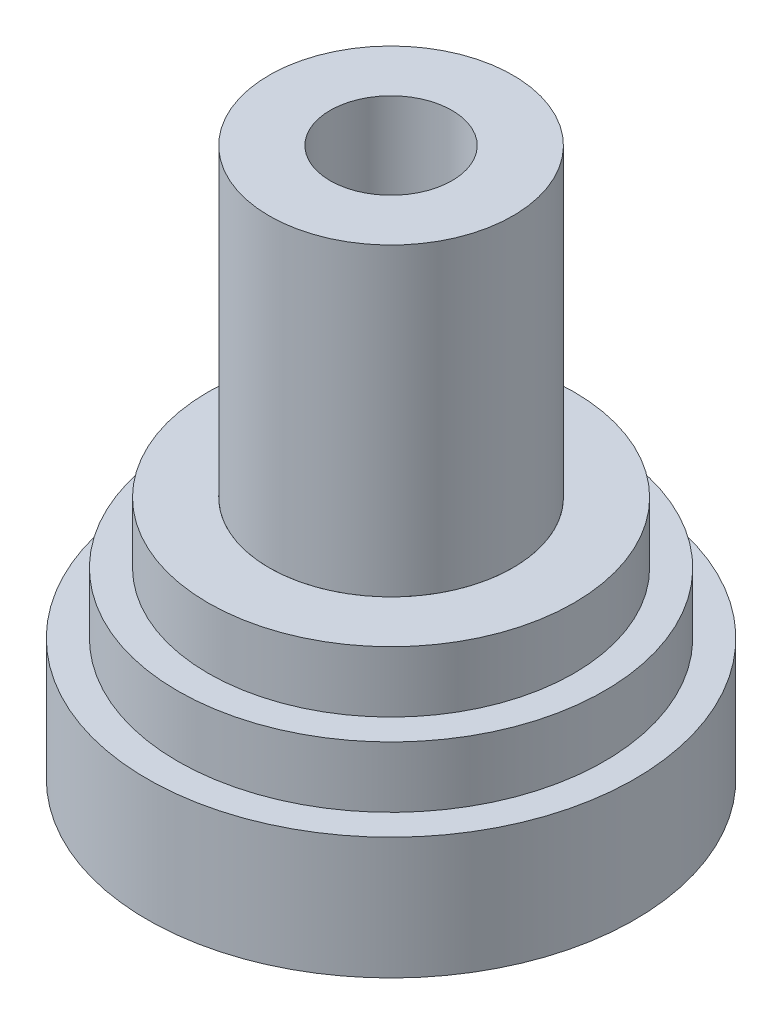
ISO-10303-21;
HEADER;
FILE_DESCRIPTION(('STEP AP214'),'2;1');
FILE_NAME('part.step','',(''),(''),'','','');
FILE_SCHEMA(('AUTOMOTIVE_DESIGN { 1 0 10303 214 1 1 1 1 }'));
ENDSEC;
DATA;
#1=APPLICATION_CONTEXT('core data for automotive mechanical design processes');
#2=APPLICATION_PROTOCOL_DEFINITION('international standard','automotive_design',2000,#1);
#3=PRODUCT_CONTEXT('',#1,'mechanical');
#4=PRODUCT('Part','Part','',(#3));
#5=PRODUCT_RELATED_PRODUCT_CATEGORY('part','',(#4));
#6=PRODUCT_DEFINITION_FORMATION('','',#4);
#7=PRODUCT_DEFINITION_CONTEXT('part definition',#1,'design');
#8=PRODUCT_DEFINITION('design','',#6,#7);
#9=PRODUCT_DEFINITION_SHAPE('','',#8);
#10=(LENGTH_UNIT() NAMED_UNIT(*) SI_UNIT(.MILLI.,.METRE.));
#11=(NAMED_UNIT(*) PLANE_ANGLE_UNIT() SI_UNIT($,.RADIAN.));
#12=(NAMED_UNIT(*) SI_UNIT($,.STERADIAN.) SOLID_ANGLE_UNIT());
#13=UNCERTAINTY_MEASURE_WITH_UNIT(LENGTH_MEASURE(1.E-05),#10,'distance_accuracy_value','');
#14=(GEOMETRIC_REPRESENTATION_CONTEXT(3) GLOBAL_UNCERTAINTY_ASSIGNED_CONTEXT((#13)) GLOBAL_UNIT_ASSIGNED_CONTEXT((#10,
#11,#12)) REPRESENTATION_CONTEXT('',''));
#15=CARTESIAN_POINT('',(0.,0.,0.));
#16=DIRECTION('',(0.,0.,1.));
#17=DIRECTION('',(1.,0.,0.));
#18=AXIS2_PLACEMENT_3D('',#15,#16,#17);
#19=CARTESIAN_POINT('',(0.,0.,-20.));
#20=DIRECTION('',(0.,1.,0.));
#21=DIRECTION('',(0.,0.,1.));
#22=AXIS2_PLACEMENT_3D('',#19,#20,#21);
#23=PLANE('',#22);
#24=CARTESIAN_POINT('',(0.,0.,0.));
#25=DIRECTION('',(0.,-1.,0.));
#26=DIRECTION('',(0.,0.,-1.));
#27=AXIS2_PLACEMENT_3D('',#24,#25,#26);
#28=CIRCLE('',#27,20.);
#29=CARTESIAN_POINT('',(0.,0.,-20.));
#30=VERTEX_POINT('',#29);
#31=EDGE_CURVE('E79',#30,#30,#28,.T.);
#32=ORIENTED_EDGE('',*,*,#31,.T.);
#33=EDGE_LOOP('',(#32));
#34=FACE_BOUND('',#33,.T.);
#35=CARTESIAN_POINT('',(0.,0.,0.));
#36=DIRECTION('',(0.,-1.,0.));
#37=DIRECTION('',(0.,0.,-1.));
#38=AXIS2_PLACEMENT_3D('',#35,#36,#37);
#39=CIRCLE('',#38,30.);
#40=CARTESIAN_POINT('',(0.,0.,-30.));
#41=VERTEX_POINT('',#40);
#42=EDGE_CURVE('E11',#41,#41,#39,.T.);
#43=ORIENTED_EDGE('',*,*,#42,.F.);
#44=EDGE_LOOP('',(#43));
#45=FACE_BOUND('',#44,.T.);
#46=ADVANCED_FACE('F45',(#34,#45),#23,.T.);
#47=CARTESIAN_POINT('',(0.,0.,0.));
#48=DIRECTION('',(0.,-1.,0.));
#49=DIRECTION('',(0.,0.,-1.));
#50=AXIS2_PLACEMENT_3D('',#47,#48,#49);
#51=CYLINDRICAL_SURFACE('',#50,30.);
#52=ORIENTED_EDGE('',*,*,#42,.T.);
#53=EDGE_LOOP('',(#52));
#54=FACE_BOUND('',#53,.T.);
#55=CARTESIAN_POINT('',(0.,-10.,0.));
#56=DIRECTION('',(0.,-1.,0.));
#57=DIRECTION('',(0.,0.,-1.));
#58=AXIS2_PLACEMENT_3D('',#55,#56,#57);
#59=CIRCLE('',#58,30.);
#60=CARTESIAN_POINT('',(0.,-10.,-30.));
#61=VERTEX_POINT('',#60);
#62=EDGE_CURVE('E51',#61,#61,#59,.T.);
#63=ORIENTED_EDGE('',*,*,#62,.F.);
#64=EDGE_LOOP('',(#63));
#65=FACE_BOUND('',#64,.T.);
#66=ADVANCED_FACE('F97',(#54,#65),#51,.T.);
#67=CARTESIAN_POINT('',(0.,-10.,-30.));
#68=DIRECTION('',(0.,1.,0.));
#69=DIRECTION('',(0.,0.,1.));
#70=AXIS2_PLACEMENT_3D('',#67,#68,#69);
#71=PLANE('',#70);
#72=ORIENTED_EDGE('',*,*,#62,.T.);
#73=EDGE_LOOP('',(#72));
#74=FACE_BOUND('',#73,.T.);
#75=CARTESIAN_POINT('',(0.,-10.,0.));
#76=DIRECTION('',(0.,-1.,0.));
#77=DIRECTION('',(0.,0.,-1.));
#78=AXIS2_PLACEMENT_3D('',#75,#76,#77);
#79=CIRCLE('',#78,35.);
#80=CARTESIAN_POINT('',(0.,-10.,-35.));
#81=VERTEX_POINT('',#80);
#82=EDGE_CURVE('E55',#81,#81,#79,.T.);
#83=ORIENTED_EDGE('',*,*,#82,.F.);
#84=EDGE_LOOP('',(#83));
#85=FACE_BOUND('',#84,.T.);
#86=ADVANCED_FACE('F101',(#74,#85),#71,.T.);
#87=CARTESIAN_POINT('',(0.,0.,0.));
#88=DIRECTION('',(0.,-1.,0.));
#89=DIRECTION('',(0.,0.,-1.));
#90=AXIS2_PLACEMENT_3D('',#87,#88,#89);
#91=CYLINDRICAL_SURFACE('',#90,35.);
#92=ORIENTED_EDGE('',*,*,#82,.T.);
#93=EDGE_LOOP('',(#92));
#94=FACE_BOUND('',#93,.T.);
#95=CARTESIAN_POINT('',(0.,-20.,0.));
#96=DIRECTION('',(0.,-1.,0.));
#97=DIRECTION('',(0.,0.,-1.));
#98=AXIS2_PLACEMENT_3D('',#95,#96,#97);
#99=CIRCLE('',#98,35.);
#100=CARTESIAN_POINT('',(0.,-20.,-35.));
#101=VERTEX_POINT('',#100);
#102=EDGE_CURVE('E59',#101,#101,#99,.T.);
#103=ORIENTED_EDGE('',*,*,#102,.F.);
#104=EDGE_LOOP('',(#103));
#105=FACE_BOUND('',#104,.T.);
#106=ADVANCED_FACE('F105',(#94,#105),#91,.T.);
#107=CARTESIAN_POINT('',(0.,-20.,-35.));
#108=DIRECTION('',(0.,1.,0.));
#109=DIRECTION('',(0.,0.,1.));
#110=AXIS2_PLACEMENT_3D('',#107,#108,#109);
#111=PLANE('',#110);
#112=ORIENTED_EDGE('',*,*,#102,.T.);
#113=EDGE_LOOP('',(#112));
#114=FACE_BOUND('',#113,.T.);
#115=CARTESIAN_POINT('',(0.,-20.,0.));
#116=DIRECTION('',(0.,-1.,0.));
#117=DIRECTION('',(0.,0.,-1.));
#118=AXIS2_PLACEMENT_3D('',#115,#116,#117);
#119=CIRCLE('',#118,40.);
#120=CARTESIAN_POINT('',(0.,-20.,-40.));
#121=VERTEX_POINT('',#120);
#122=EDGE_CURVE('E64',#121,#121,#119,.T.);
#123=ORIENTED_EDGE('',*,*,#122,.F.);
#124=EDGE_LOOP('',(#123));
#125=FACE_BOUND('',#124,.T.);
#126=ADVANCED_FACE('F111',(#114,#125),#111,.T.);
#127=CARTESIAN_POINT('',(0.,0.,0.));
#128=DIRECTION('',(0.,-1.,0.));
#129=DIRECTION('',(0.,0.,-1.));
#130=AXIS2_PLACEMENT_3D('',#127,#128,#129);
#131=CYLINDRICAL_SURFACE('',#130,40.);
#132=ORIENTED_EDGE('',*,*,#122,.T.);
#133=EDGE_LOOP('',(#132));
#134=FACE_BOUND('',#133,.T.);
#135=CARTESIAN_POINT('',(0.,-40.,0.));
#136=DIRECTION('',(0.,-1.,0.));
#137=DIRECTION('',(0.,0.,-1.));
#138=AXIS2_PLACEMENT_3D('',#135,#136,#137);
#139=CIRCLE('',#138,40.);
#140=CARTESIAN_POINT('',(0.,-40.,-40.));
#141=VERTEX_POINT('',#140);
#142=EDGE_CURVE('E67',#141,#141,#139,.T.);
#143=ORIENTED_EDGE('',*,*,#142,.F.);
#144=EDGE_LOOP('',(#143));
#145=FACE_BOUND('',#144,.T.);
#146=ADVANCED_FACE('F115',(#134,#145),#131,.T.);
#147=CARTESIAN_POINT('',(0.,-40.,-40.));
#148=DIRECTION('',(0.,-1.,0.));
#149=DIRECTION('',(0.,0.,-1.));
#150=AXIS2_PLACEMENT_3D('',#147,#148,#149);
#151=PLANE('',#150);
#152=ORIENTED_EDGE('',*,*,#142,.T.);
#153=EDGE_LOOP('',(#152));
#154=FACE_BOUND('',#153,.T.);
#155=CARTESIAN_POINT('',(0.,-40.,0.));
#156=DIRECTION('',(0.,-1.,0.));
#157=DIRECTION('',(0.,0.,-1.));
#158=AXIS2_PLACEMENT_3D('',#155,#156,#157);
#159=CIRCLE('',#158,30.);
#160=CARTESIAN_POINT('',(0.,-40.,-30.));
#161=VERTEX_POINT('',#160);
#162=EDGE_CURVE('E70',#161,#161,#159,.T.);
#163=ORIENTED_EDGE('',*,*,#162,.F.);
#164=EDGE_LOOP('',(#163));
#165=FACE_BOUND('',#164,.T.);
#166=ADVANCED_FACE('F119',(#154,#165),#151,.T.);
#167=CARTESIAN_POINT('',(0.,0.,0.));
#168=DIRECTION('',(0.,-1.,0.));
#169=DIRECTION('',(0.,0.,-1.));
#170=AXIS2_PLACEMENT_3D('',#167,#168,#169);
#171=CYLINDRICAL_SURFACE('',#170,30.);
#172=ORIENTED_EDGE('',*,*,#162,.T.);
#173=EDGE_LOOP('',(#172));
#174=FACE_BOUND('',#173,.T.);
#175=CARTESIAN_POINT('',(0.,-15.,0.));
#176=DIRECTION('',(0.,-1.,0.));
#177=DIRECTION('',(0.,0.,-1.));
#178=AXIS2_PLACEMENT_3D('',#175,#176,#177);
#179=CIRCLE('',#178,30.);
#180=CARTESIAN_POINT('',(0.,-15.,-30.));
#181=VERTEX_POINT('',#180);
#182=EDGE_CURVE('E73',#181,#181,#179,.T.);
#183=ORIENTED_EDGE('',*,*,#182,.F.);
#184=EDGE_LOOP('',(#183));
#185=FACE_BOUND('',#184,.T.);
#186=ADVANCED_FACE('F93',(#174,#185),#171,.F.);
#187=CARTESIAN_POINT('',(0.,-15.,-30.));
#188=DIRECTION('',(0.,-1.,0.));
#189=DIRECTION('',(0.,0.,-1.));
#190=AXIS2_PLACEMENT_3D('',#187,#188,#189);
#191=PLANE('',#190);
#192=ORIENTED_EDGE('',*,*,#182,.T.);
#193=EDGE_LOOP('',(#192));
#194=FACE_BOUND('',#193,.T.);
#195=CARTESIAN_POINT('',(0.,-15.,0.));
#196=DIRECTION('',(0.,-1.,0.));
#197=DIRECTION('',(0.,0.,-1.));
#198=AXIS2_PLACEMENT_3D('',#195,#196,#197);
#199=CIRCLE('',#198,20.);
#200=CARTESIAN_POINT('',(0.,-15.,-20.));
#201=VERTEX_POINT('',#200);
#202=EDGE_CURVE('E76',#201,#201,#199,.T.);
#203=ORIENTED_EDGE('',*,*,#202,.F.);
#204=EDGE_LOOP('',(#203));
#205=FACE_BOUND('',#204,.T.);
#206=ADVANCED_FACE('F87',(#194,#205),#191,.T.);
#207=CARTESIAN_POINT('',(0.,0.,0.));
#208=DIRECTION('',(0.,-1.,0.));
#209=DIRECTION('',(0.,0.,-1.));
#210=AXIS2_PLACEMENT_3D('',#207,#208,#209);
#211=CYLINDRICAL_SURFACE('',#210,20.);
#212=ORIENTED_EDGE('',*,*,#202,.T.);
#213=EDGE_LOOP('',(#212));
#214=FACE_BOUND('',#213,.T.);
#215=ORIENTED_EDGE('',*,*,#31,.F.);
#216=EDGE_LOOP('',(#215));
#217=FACE_BOUND('',#216,.T.);
#218=ADVANCED_FACE('F85',(#214,#217),#211,.F.);
#219=CLOSED_SHELL('',(#46,#66,#86,#106,#126,#146,#166,#186,#206,#218));
#220=MANIFOLD_SOLID_BREP('B2',#219);
#221=CARTESIAN_POINT('',(0.,50.,0.));
#222=DIRECTION('',(0.,-1.,0.));
#223=DIRECTION('',(0.,0.,-1.));
#224=AXIS2_PLACEMENT_3D('',#221,#222,#223);
#225=CYLINDRICAL_SURFACE('',#224,20.);
#226=CARTESIAN_POINT('',(0.,50.,0.));
#227=DIRECTION('',(0.,1.,0.));
#228=DIRECTION('',(0.,0.,1.));
#229=AXIS2_PLACEMENT_3D('',#226,#227,#228);
#230=CIRCLE('',#229,20.);
#231=CARTESIAN_POINT('',(0.,50.,20.));
#232=VERTEX_POINT('',#231);
#233=EDGE_CURVE('E44',#232,#232,#230,.T.);
#234=ORIENTED_EDGE('',*,*,#233,.F.);
#235=EDGE_LOOP('',(#234));
#236=FACE_BOUND('',#235,.T.);
#237=CARTESIAN_POINT('',(0.,0.,0.));
#238=DIRECTION('',(0.,1.,0.));
#239=DIRECTION('',(0.,0.,1.));
#240=AXIS2_PLACEMENT_3D('',#237,#238,#239);
#241=CIRCLE('',#240,20.);
#242=CARTESIAN_POINT('',(0.,0.,20.));
#243=VERTEX_POINT('',#242);
#244=EDGE_CURVE('E200',#243,#243,#241,.T.);
#245=ORIENTED_EDGE('',*,*,#244,.T.);
#246=EDGE_LOOP('',(#245));
#247=FACE_BOUND('',#246,.T.);
#248=ADVANCED_FACE('F197',(#236,#247),#225,.T.);
#249=CARTESIAN_POINT('',(0.,50.,0.));
#250=DIRECTION('',(0.,1.,0.));
#251=DIRECTION('',(0.,0.,1.));
#252=AXIS2_PLACEMENT_3D('',#249,#250,#251);
#253=PLANE('',#252);
#254=CARTESIAN_POINT('',(0.,50.,0.));
#255=DIRECTION('',(0.,1.,0.));
#256=DIRECTION('',(0.,0.,1.));
#257=AXIS2_PLACEMENT_3D('',#254,#255,#256);
#258=CIRCLE('',#257,10.);
#259=CARTESIAN_POINT('',(0.,50.,10.));
#260=VERTEX_POINT('',#259);
#261=EDGE_CURVE('E209',#260,#260,#258,.T.);
#262=ORIENTED_EDGE('',*,*,#261,.F.);
#263=EDGE_LOOP('',(#262));
#264=FACE_BOUND('',#263,.T.);
#265=ORIENTED_EDGE('',*,*,#233,.T.);
#266=EDGE_LOOP('',(#265));
#267=FACE_BOUND('',#266,.T.);
#268=ADVANCED_FACE('F224',(#264,#267),#253,.T.);
#269=CARTESIAN_POINT('',(0.,0.,0.));
#270=DIRECTION('',(0.,1.,0.));
#271=DIRECTION('',(0.,0.,1.));
#272=AXIS2_PLACEMENT_3D('',#269,#270,#271);
#273=PLANE('',#272);
#274=CARTESIAN_POINT('',(0.,0.,0.));
#275=DIRECTION('',(0.,1.,0.));
#276=DIRECTION('',(0.,0.,1.));
#277=AXIS2_PLACEMENT_3D('',#274,#275,#276);
#278=CIRCLE('',#277,10.);
#279=CARTESIAN_POINT('',(0.,0.,10.));
#280=VERTEX_POINT('',#279);
#281=EDGE_CURVE('E207',#280,#280,#278,.T.);
#282=ORIENTED_EDGE('',*,*,#281,.T.);
#283=EDGE_LOOP('',(#282));
#284=FACE_BOUND('',#283,.T.);
#285=ORIENTED_EDGE('',*,*,#244,.F.);
#286=EDGE_LOOP('',(#285));
#287=FACE_BOUND('',#286,.T.);
#288=ADVANCED_FACE('F215',(#284,#287),#273,.F.);
#289=CARTESIAN_POINT('',(0.,0.,0.));
#290=DIRECTION('',(0.,1.,0.));
#291=DIRECTION('',(0.,0.,1.));
#292=AXIS2_PLACEMENT_3D('',#289,#290,#291);
#293=CYLINDRICAL_SURFACE('',#292,10.);
#294=ORIENTED_EDGE('',*,*,#281,.F.);
#295=EDGE_LOOP('',(#294));
#296=FACE_BOUND('',#295,.T.);
#297=ORIENTED_EDGE('',*,*,#261,.T.);
#298=EDGE_LOOP('',(#297));
#299=FACE_BOUND('',#298,.T.);
#300=ADVANCED_FACE('F218',(#296,#299),#293,.F.);
#301=CLOSED_SHELL('',(#248,#268,#288,#300));
#302=MANIFOLD_SOLID_BREP('B6',#301);
#303=ADVANCED_BREP_SHAPE_REPRESENTATION('',(#18,#220,#302),#14);
#304=SHAPE_DEFINITION_REPRESENTATION(#9,#303);
ENDSEC;
END-ISO-10303-21;
